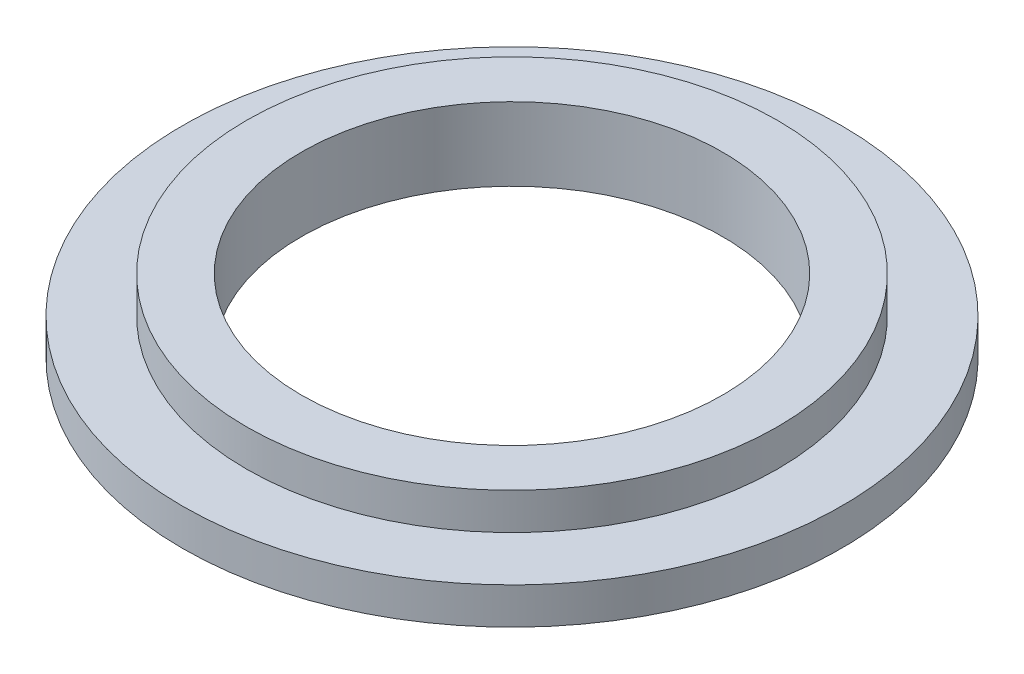
ISO-10303-21;
HEADER;
FILE_DESCRIPTION(('STEP AP214'),'2;1');
FILE_NAME('part.step','',(''),(''),'','','');
FILE_SCHEMA(('AUTOMOTIVE_DESIGN { 1 0 10303 214 1 1 1 1 }'));
ENDSEC;
DATA;
#1=APPLICATION_CONTEXT('core data for automotive mechanical design processes');
#2=APPLICATION_PROTOCOL_DEFINITION('international standard','automotive_design',2000,#1);
#3=PRODUCT_CONTEXT('',#1,'mechanical');
#4=PRODUCT('Part','Part','',(#3));
#5=PRODUCT_RELATED_PRODUCT_CATEGORY('part','',(#4));
#6=PRODUCT_DEFINITION_FORMATION('','',#4);
#7=PRODUCT_DEFINITION_CONTEXT('part definition',#1,'design');
#8=PRODUCT_DEFINITION('design','',#6,#7);
#9=PRODUCT_DEFINITION_SHAPE('','',#8);
#10=(LENGTH_UNIT() NAMED_UNIT(*) SI_UNIT(.MILLI.,.METRE.));
#11=(NAMED_UNIT(*) PLANE_ANGLE_UNIT() SI_UNIT($,.RADIAN.));
#12=(NAMED_UNIT(*) SI_UNIT($,.STERADIAN.) SOLID_ANGLE_UNIT());
#13=UNCERTAINTY_MEASURE_WITH_UNIT(LENGTH_MEASURE(1.E-05),#10,'distance_accuracy_value','');
#14=(GEOMETRIC_REPRESENTATION_CONTEXT(3) GLOBAL_UNCERTAINTY_ASSIGNED_CONTEXT((#13)) GLOBAL_UNIT_ASSIGNED_CONTEXT((#10,
#11,#12)) REPRESENTATION_CONTEXT('',''));
#15=CARTESIAN_POINT('',(0.,0.,0.));
#16=DIRECTION('',(0.,0.,1.));
#17=DIRECTION('',(1.,0.,0.));
#18=AXIS2_PLACEMENT_3D('',#15,#16,#17);
#19=CARTESIAN_POINT('',(0.,2.,0.));
#20=DIRECTION('',(0.,-1.,0.));
#21=DIRECTION('',(0.,0.,-1.));
#22=AXIS2_PLACEMENT_3D('',#19,#20,#21);
#23=CYLINDRICAL_SURFACE('',#22,18.);
#24=CARTESIAN_POINT('',(0.,2.,0.));
#25=DIRECTION('',(0.,1.,0.));
#26=DIRECTION('',(0.,0.,1.));
#27=AXIS2_PLACEMENT_3D('',#24,#25,#26);
#28=CIRCLE('',#27,18.);
#29=CARTESIAN_POINT('',(0.,2.,18.));
#30=VERTEX_POINT('',#29);
#31=EDGE_CURVE('E41',#30,#30,#28,.T.);
#32=ORIENTED_EDGE('',*,*,#31,.F.);
#33=EDGE_LOOP('',(#32));
#34=FACE_BOUND('',#33,.T.);
#35=CARTESIAN_POINT('',(0.,0.,0.));
#36=DIRECTION('',(0.,1.,0.));
#37=DIRECTION('',(0.,0.,1.));
#38=AXIS2_PLACEMENT_3D('',#35,#36,#37);
#39=CIRCLE('',#38,18.);
#40=CARTESIAN_POINT('',(0.,0.,18.));
#41=VERTEX_POINT('',#40);
#42=EDGE_CURVE('E37',#41,#41,#39,.T.);
#43=ORIENTED_EDGE('',*,*,#42,.T.);
#44=EDGE_LOOP('',(#43));
#45=FACE_BOUND('',#44,.T.);
#46=ADVANCED_FACE('F34',(#34,#45),#23,.T.);
#47=CARTESIAN_POINT('',(0.,2.,0.));
#48=DIRECTION('',(0.,1.,0.));
#49=DIRECTION('',(0.,0.,1.));
#50=AXIS2_PLACEMENT_3D('',#47,#48,#49);
#51=PLANE('',#50);
#52=CARTESIAN_POINT('',(0.,2.,0.));
#53=DIRECTION('',(0.,1.,0.));
#54=DIRECTION('',(0.,0.,1.));
#55=AXIS2_PLACEMENT_3D('',#52,#53,#54);
#56=CIRCLE('',#55,14.5);
#57=CARTESIAN_POINT('',(0.,2.,14.5));
#58=VERTEX_POINT('',#57);
#59=EDGE_CURVE('E10',#58,#58,#56,.T.);
#60=ORIENTED_EDGE('',*,*,#59,.F.);
#61=EDGE_LOOP('',(#60));
#62=FACE_BOUND('',#61,.T.);
#63=ORIENTED_EDGE('',*,*,#31,.T.);
#64=EDGE_LOOP('',(#63));
#65=FACE_BOUND('',#64,.T.);
#66=ADVANCED_FACE('F73',(#62,#65),#51,.T.);
#67=CARTESIAN_POINT('',(0.,0.,0.));
#68=DIRECTION('',(0.,1.,0.));
#69=DIRECTION('',(0.,0.,1.));
#70=AXIS2_PLACEMENT_3D('',#67,#68,#69);
#71=PLANE('',#70);
#72=CARTESIAN_POINT('',(0.,0.,0.));
#73=DIRECTION('',(0.,1.,0.));
#74=DIRECTION('',(0.,0.,1.));
#75=AXIS2_PLACEMENT_3D('',#72,#73,#74);
#76=CIRCLE('',#75,11.5);
#77=CARTESIAN_POINT('',(0.,0.,11.5));
#78=VERTEX_POINT('',#77);
#79=EDGE_CURVE('E50',#78,#78,#76,.T.);
#80=ORIENTED_EDGE('',*,*,#79,.T.);
#81=EDGE_LOOP('',(#80));
#82=FACE_BOUND('',#81,.T.);
#83=ORIENTED_EDGE('',*,*,#42,.F.);
#84=EDGE_LOOP('',(#83));
#85=FACE_BOUND('',#84,.T.);
#86=ADVANCED_FACE('F68',(#82,#85),#71,.F.);
#87=CARTESIAN_POINT('',(0.,4.,0.));
#88=DIRECTION('',(0.,-1.,0.));
#89=DIRECTION('',(0.,0.,-1.));
#90=AXIS2_PLACEMENT_3D('',#87,#88,#89);
#91=CYLINDRICAL_SURFACE('',#90,14.5);
#92=CARTESIAN_POINT('',(0.,4.,0.));
#93=DIRECTION('',(0.,1.,0.));
#94=DIRECTION('',(0.,0.,1.));
#95=AXIS2_PLACEMENT_3D('',#92,#93,#94);
#96=CIRCLE('',#95,14.5);
#97=CARTESIAN_POINT('',(0.,4.,14.5));
#98=VERTEX_POINT('',#97);
#99=EDGE_CURVE('E47',#98,#98,#96,.T.);
#100=ORIENTED_EDGE('',*,*,#99,.F.);
#101=EDGE_LOOP('',(#100));
#102=FACE_BOUND('',#101,.T.);
#103=ORIENTED_EDGE('',*,*,#59,.T.);
#104=EDGE_LOOP('',(#103));
#105=FACE_BOUND('',#104,.T.);
#106=ADVANCED_FACE('F63',(#102,#105),#91,.T.);
#107=CARTESIAN_POINT('',(0.,4.,0.));
#108=DIRECTION('',(0.,1.,0.));
#109=DIRECTION('',(0.,0.,1.));
#110=AXIS2_PLACEMENT_3D('',#107,#108,#109);
#111=PLANE('',#110);
#112=CARTESIAN_POINT('',(0.,4.,0.));
#113=DIRECTION('',(0.,1.,0.));
#114=DIRECTION('',(0.,0.,1.));
#115=AXIS2_PLACEMENT_3D('',#112,#113,#114);
#116=CIRCLE('',#115,11.5);
#117=CARTESIAN_POINT('',(0.,4.,11.5));
#118=VERTEX_POINT('',#117);
#119=EDGE_CURVE('E53',#118,#118,#116,.T.);
#120=ORIENTED_EDGE('',*,*,#119,.F.);
#121=EDGE_LOOP('',(#120));
#122=FACE_BOUND('',#121,.T.);
#123=ORIENTED_EDGE('',*,*,#99,.T.);
#124=EDGE_LOOP('',(#123));
#125=FACE_BOUND('',#124,.T.);
#126=ADVANCED_FACE('F60',(#122,#125),#111,.T.);
#127=CARTESIAN_POINT('',(0.,-1.2E-05,0.));
#128=DIRECTION('',(0.,1.,0.));
#129=DIRECTION('',(0.,0.,1.));
#130=AXIS2_PLACEMENT_3D('',#127,#128,#129);
#131=CYLINDRICAL_SURFACE('',#130,11.5);
#132=CARTESIAN_POINT('',(0.,4.,11.5));
#133=CARTESIAN_POINT('',(0.,3.95833333333333,11.5));
#134=CARTESIAN_POINT('',(0.,3.91666666666667,11.5));
#135=CARTESIAN_POINT('',(0.,3.83333333333333,11.5));
#136=CARTESIAN_POINT('',(0.,3.79166666666667,11.5));
#137=CARTESIAN_POINT('',(0.,3.70833333333333,11.5));
#138=CARTESIAN_POINT('',(0.,3.66666666666667,11.5));
#139=CARTESIAN_POINT('',(0.,3.58333333333333,11.5));
#140=CARTESIAN_POINT('',(0.,3.54166666666667,11.5));
#141=CARTESIAN_POINT('',(0.,3.45833333333333,11.5));
#142=CARTESIAN_POINT('',(0.,3.41666666666667,11.5));
#143=CARTESIAN_POINT('',(0.,3.33333333333333,11.5));
#144=CARTESIAN_POINT('',(0.,3.29166666666667,11.5));
#145=CARTESIAN_POINT('',(0.,3.20833333333333,11.5));
#146=CARTESIAN_POINT('',(0.,3.16666666666667,11.5));
#147=CARTESIAN_POINT('',(0.,3.08333333333333,11.5));
#148=CARTESIAN_POINT('',(0.,3.04166666666667,11.5));
#149=CARTESIAN_POINT('',(0.,2.95833333333333,11.5));
#150=CARTESIAN_POINT('',(0.,2.91666666666667,11.5));
#151=CARTESIAN_POINT('',(0.,2.83333333333333,11.5));
#152=CARTESIAN_POINT('',(0.,2.79166666666667,11.5));
#153=CARTESIAN_POINT('',(0.,2.70833333333333,11.5));
#154=CARTESIAN_POINT('',(0.,2.66666666666667,11.5));
#155=CARTESIAN_POINT('',(0.,2.58333333333333,11.5));
#156=CARTESIAN_POINT('',(0.,2.54166666666667,11.5));
#157=CARTESIAN_POINT('',(0.,2.45833333333333,11.5));
#158=CARTESIAN_POINT('',(0.,2.41666666666667,11.5));
#159=CARTESIAN_POINT('',(0.,2.33333333333333,11.5));
#160=CARTESIAN_POINT('',(0.,2.29166666666667,11.5));
#161=CARTESIAN_POINT('',(0.,2.20833333333333,11.5));
#162=CARTESIAN_POINT('',(0.,2.16666666666667,11.5));
#163=CARTESIAN_POINT('',(0.,2.08333333333333,11.5));
#164=CARTESIAN_POINT('',(0.,2.04166666666667,11.5));
#165=CARTESIAN_POINT('',(0.,1.95833333333333,11.5));
#166=CARTESIAN_POINT('',(0.,1.91666666666667,11.5));
#167=CARTESIAN_POINT('',(0.,1.83333333333333,11.5));
#168=CARTESIAN_POINT('',(0.,1.79166666666667,11.5));
#169=CARTESIAN_POINT('',(0.,1.70833333333333,11.5));
#170=CARTESIAN_POINT('',(0.,1.66666666666667,11.5));
#171=CARTESIAN_POINT('',(0.,1.58333333333333,11.5));
#172=CARTESIAN_POINT('',(0.,1.54166666666667,11.5));
#173=CARTESIAN_POINT('',(0.,1.45833333333333,11.5));
#174=CARTESIAN_POINT('',(0.,1.41666666666667,11.5));
#175=CARTESIAN_POINT('',(0.,1.33333333333333,11.5));
#176=CARTESIAN_POINT('',(0.,1.29166666666667,11.5));
#177=CARTESIAN_POINT('',(0.,1.20833333333333,11.5));
#178=CARTESIAN_POINT('',(0.,1.16666666666667,11.5));
#179=CARTESIAN_POINT('',(0.,1.08333333333333,11.5));
#180=CARTESIAN_POINT('',(0.,1.04166666666667,11.5));
#181=CARTESIAN_POINT('',(0.,0.958333333333333,11.5));
#182=CARTESIAN_POINT('',(0.,0.916666666666667,11.5));
#183=CARTESIAN_POINT('',(0.,0.833333333333333,11.5));
#184=CARTESIAN_POINT('',(0.,0.791666666666667,11.5));
#185=CARTESIAN_POINT('',(0.,0.708333333333333,11.5));
#186=CARTESIAN_POINT('',(0.,0.666666666666667,11.5));
#187=CARTESIAN_POINT('',(0.,0.583333333333333,11.5));
#188=CARTESIAN_POINT('',(0.,0.541666666666666,11.5));
#189=CARTESIAN_POINT('',(0.,0.458333333333333,11.5));
#190=CARTESIAN_POINT('',(0.,0.416666666666666,11.5));
#191=CARTESIAN_POINT('',(0.,0.333333333333333,11.5));
#192=CARTESIAN_POINT('',(0.,0.291666666666666,11.5));
#193=CARTESIAN_POINT('',(0.,0.208333333333333,11.5));
#194=CARTESIAN_POINT('',(0.,0.166666666666667,11.5));
#195=CARTESIAN_POINT('',(0.,0.0833333333333331,11.5));
#196=CARTESIAN_POINT('',(0.,0.0416666666666665,11.5));
#197=CARTESIAN_POINT('',(0.,0.,11.5));
#198=B_SPLINE_CURVE_WITH_KNOTS('',3,(#132,#133,#134,#135,#136,#137,#138,#139,#140,#141,#142,
#143,#144,#145,#146,#147,#148,#149,#150,#151,#152,#153,#154,#155,#156,#157,#158,#159,#160,#161,
#162,#163,#164,#165,#166,#167,#168,#169,#170,#171,#172,#173,#174,#175,#176,#177,#178,#179,#180,
#181,#182,#183,#184,#185,#186,#187,#188,#189,#190,#191,#192,#193,#194,#195,#196,#197),
.UNSPECIFIED.,.F.,.F.,(4,2,2,2,2,2,2,2,2,2,2,2,2,2,2,2,2,2,2,2,2,2,2,2,2,2,2,2,2,2,2,2,4),(0.,
0.125,0.25,0.375,0.5,0.625,0.75,0.875,1.,1.125,1.25,1.375,1.5,1.625,1.75,1.875,2.,2.125,2.25,
2.375,2.5,2.625,2.75,2.875,3.,3.125,3.25,3.375,3.5,3.625,3.75,3.875,4.),.UNSPECIFIED.);
#199=EDGE_CURVE('BSEAM57',#118,#78,#198,.T.);
#200=ORIENTED_EDGE('',*,*,#119,.T.);
#201=ORIENTED_EDGE('',*,*,#79,.F.);
#202=ORIENTED_EDGE('',*,*,#199,.T.);
#203=ORIENTED_EDGE('',*,*,#199,.F.);
#204=EDGE_LOOP('',(#200,#202,#201,#203));
#205=FACE_BOUND('',#204,.T.);
#206=ADVANCED_FACE('F57',(#205),#131,.F.);
#207=CLOSED_SHELL('',(#46,#66,#86,#106,#126,#206));
#208=MANIFOLD_SOLID_BREP('B2',#207);
#209=ADVANCED_BREP_SHAPE_REPRESENTATION('',(#18,#208),#14);
#210=SHAPE_DEFINITION_REPRESENTATION(#9,#209);
ENDSEC;
END-ISO-10303-21;
